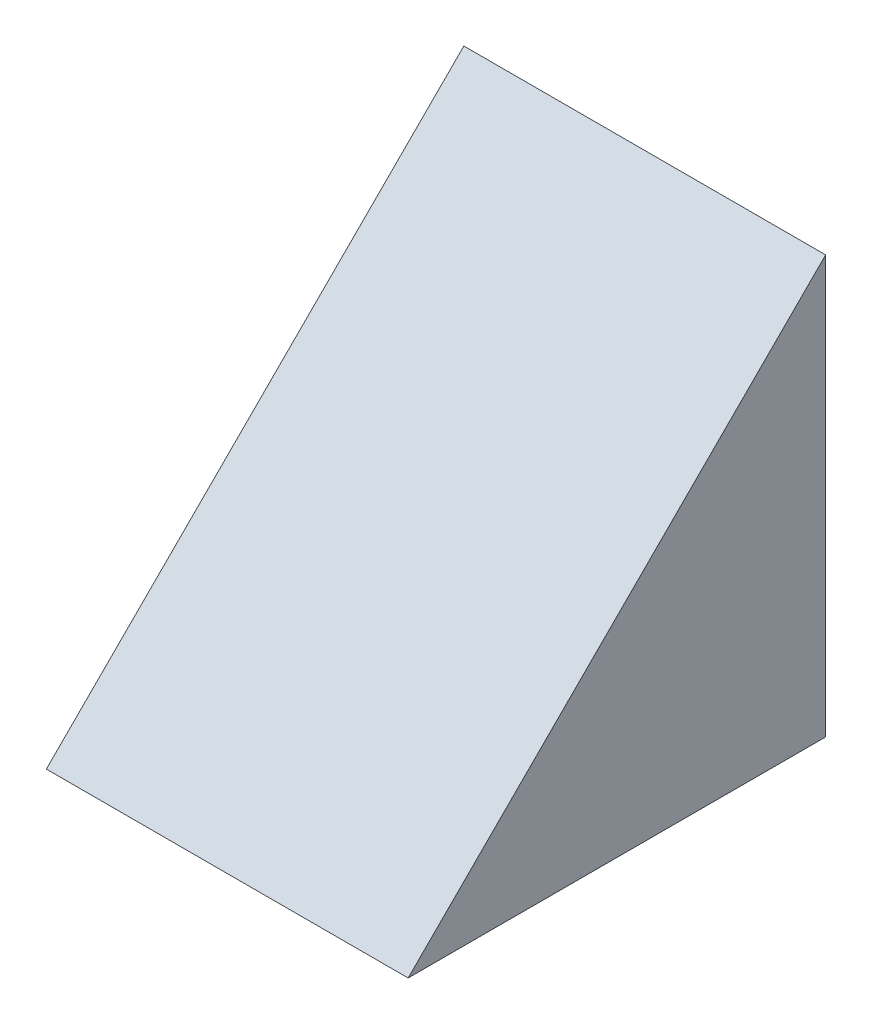
ISO-10303-21;
HEADER;
FILE_DESCRIPTION(('STEP AP214'),'2;1');
FILE_NAME('part.step','',(''),(''),'','','');
FILE_SCHEMA(('AUTOMOTIVE_DESIGN { 1 0 10303 214 1 1 1 1 }'));
ENDSEC;
DATA;
#1=APPLICATION_CONTEXT('core data for automotive mechanical design processes');
#2=APPLICATION_PROTOCOL_DEFINITION('international standard','automotive_design',2000,#1);
#3=PRODUCT_CONTEXT('',#1,'mechanical');
#4=PRODUCT('Part','Part','',(#3));
#5=PRODUCT_RELATED_PRODUCT_CATEGORY('part','',(#4));
#6=PRODUCT_DEFINITION_FORMATION('','',#4);
#7=PRODUCT_DEFINITION_CONTEXT('part definition',#1,'design');
#8=PRODUCT_DEFINITION('design','',#6,#7);
#9=PRODUCT_DEFINITION_SHAPE('','',#8);
#10=(LENGTH_UNIT() NAMED_UNIT(*) SI_UNIT(.MILLI.,.METRE.));
#11=(NAMED_UNIT(*) PLANE_ANGLE_UNIT() SI_UNIT($,.RADIAN.));
#12=(NAMED_UNIT(*) SI_UNIT($,.STERADIAN.) SOLID_ANGLE_UNIT());
#13=UNCERTAINTY_MEASURE_WITH_UNIT(LENGTH_MEASURE(1.E-05),#10,'distance_accuracy_value','');
#14=(GEOMETRIC_REPRESENTATION_CONTEXT(3) GLOBAL_UNCERTAINTY_ASSIGNED_CONTEXT((#13)) GLOBAL_UNIT_ASSIGNED_CONTEXT((#10,
#11,#12)) REPRESENTATION_CONTEXT('',''));
#15=CARTESIAN_POINT('',(0.,0.,0.));
#16=DIRECTION('',(0.,0.,1.));
#17=DIRECTION('',(1.,0.,0.));
#18=AXIS2_PLACEMENT_3D('',#15,#16,#17);
#19=CARTESIAN_POINT('',(-31.9579620432031,-51.9051508754386,37.3029575588053));
#20=DIRECTION('',(0.,-1.,0.));
#21=DIRECTION('',(0.,0.,-1.));
#22=AXIS2_PLACEMENT_3D('',#19,#20,#21);
#23=PLANE('',#22);
#24=DIRECTION('',(0.,0.,-1.));
#25=VECTOR('',#24,1.);
#26=CARTESIAN_POINT('',(-5.95796204320314,-51.9051508754386,37.3029575588053));
#27=LINE('',#26,#25);
#28=CARTESIAN_POINT('',(-5.95796204320314,-51.9051508754386,37.3029575588053));
#29=VERTEX_POINT('',#28);
#30=CARTESIAN_POINT('',(-5.95796204320314,-51.9051508754379,7.30295755880607));
#31=VERTEX_POINT('',#30);
#32=EDGE_CURVE('E85',#29,#31,#27,.T.);
#33=ORIENTED_EDGE('',*,*,#32,.F.);
#34=DIRECTION('',(1.,0.,0.));
#35=VECTOR('',#34,1.);
#36=CARTESIAN_POINT('',(-31.9579620432031,-51.9051508754386,37.3029575588053));
#37=LINE('',#36,#35);
#38=CARTESIAN_POINT('',(-31.9579620432031,-51.9051508754386,37.3029575588053));
#39=VERTEX_POINT('',#38);
#40=EDGE_CURVE('E11',#39,#29,#37,.T.);
#41=ORIENTED_EDGE('',*,*,#40,.F.);
#42=DIRECTION('',(0.,0.,-1.));
#43=VECTOR('',#42,1.);
#44=CARTESIAN_POINT('',(-31.9579620432031,-51.9051508754386,37.3029575588053));
#45=LINE('',#44,#43);
#46=CARTESIAN_POINT('',(-31.9579620432031,-51.9051508754379,7.30295755880607));
#47=VERTEX_POINT('',#46);
#48=EDGE_CURVE('E77',#39,#47,#45,.T.);
#49=ORIENTED_EDGE('',*,*,#48,.T.);
#50=DIRECTION('',(1.,0.,0.));
#51=VECTOR('',#50,1.);
#52=CARTESIAN_POINT('',(-31.9579620432031,-51.9051508754379,7.30295755880607));
#53=LINE('',#52,#51);
#54=EDGE_CURVE('E36',#47,#31,#53,.T.);
#55=ORIENTED_EDGE('',*,*,#54,.T.);
#56=EDGE_LOOP('',(#33,#41,#49,#55));
#57=FACE_BOUND('',#56,.T.);
#58=ADVANCED_FACE('F33',(#57),#23,.T.);
#59=CARTESIAN_POINT('',(-31.9579620432031,-21.9051508754379,7.30295755880607));
#60=DIRECTION('',(0.,0.70710678118653,0.707106781186565));
#61=DIRECTION('',(0.,-0.707106781186565,0.70710678118653));
#62=AXIS2_PLACEMENT_3D('',#59,#60,#61);
#63=PLANE('',#62);
#64=DIRECTION('',(0.,-0.707106781186565,0.70710678118653));
#65=VECTOR('',#64,1.);
#66=CARTESIAN_POINT('',(-5.95796204320314,-21.9051508754379,7.30295755880607));
#67=LINE('',#66,#65);
#68=CARTESIAN_POINT('',(-5.95796204320314,-21.9051508754379,7.30295755880607));
#69=VERTEX_POINT('',#68);
#70=EDGE_CURVE('E79',#69,#29,#67,.T.);
#71=ORIENTED_EDGE('',*,*,#70,.F.);
#72=DIRECTION('',(1.,0.,0.));
#73=VECTOR('',#72,1.);
#74=CARTESIAN_POINT('',(-31.9579620432031,-21.9051508754379,7.30295755880607));
#75=LINE('',#74,#73);
#76=CARTESIAN_POINT('',(-31.9579620432031,-21.9051508754379,7.30295755880607));
#77=VERTEX_POINT('',#76);
#78=EDGE_CURVE('E42',#77,#69,#75,.T.);
#79=ORIENTED_EDGE('',*,*,#78,.F.);
#80=DIRECTION('',(0.,-0.707106781186565,0.70710678118653));
#81=VECTOR('',#80,1.);
#82=CARTESIAN_POINT('',(-31.9579620432031,-21.9051508754379,7.30295755880607));
#83=LINE('',#82,#81);
#84=EDGE_CURVE('E74',#77,#39,#83,.T.);
#85=ORIENTED_EDGE('',*,*,#84,.T.);
#86=ORIENTED_EDGE('',*,*,#40,.T.);
#87=EDGE_LOOP('',(#71,#79,#85,#86));
#88=FACE_BOUND('',#87,.T.);
#89=ADVANCED_FACE('F89',(#88),#63,.T.);
#90=CARTESIAN_POINT('',(-31.9579620432031,-51.9051508754379,7.30295755880607));
#91=DIRECTION('',(0.,0.,-1.));
#92=DIRECTION('',(0.,1.,0.));
#93=AXIS2_PLACEMENT_3D('',#90,#91,#92);
#94=PLANE('',#93);
#95=DIRECTION('',(0.,1.,0.));
#96=VECTOR('',#95,1.);
#97=CARTESIAN_POINT('',(-5.95796204320314,-51.9051508754379,7.30295755880607));
#98=LINE('',#97,#96);
#99=EDGE_CURVE('E72',#31,#69,#98,.T.);
#100=ORIENTED_EDGE('',*,*,#99,.F.);
#101=ORIENTED_EDGE('',*,*,#54,.F.);
#102=DIRECTION('',(0.,1.,0.));
#103=VECTOR('',#102,1.);
#104=CARTESIAN_POINT('',(-31.9579620432031,-51.9051508754379,7.30295755880607));
#105=LINE('',#104,#103);
#106=EDGE_CURVE('E70',#47,#77,#105,.T.);
#107=ORIENTED_EDGE('',*,*,#106,.T.);
#108=ORIENTED_EDGE('',*,*,#78,.T.);
#109=EDGE_LOOP('',(#100,#101,#107,#108));
#110=FACE_BOUND('',#109,.T.);
#111=ADVANCED_FACE('F69',(#110),#94,.T.);
#112=CARTESIAN_POINT('',(-31.9579620432031,0.,0.));
#113=DIRECTION('',(1.,0.,0.));
#114=DIRECTION('',(0.,0.,-1.));
#115=AXIS2_PLACEMENT_3D('',#112,#113,#114);
#116=PLANE('',#115);
#117=ORIENTED_EDGE('',*,*,#48,.F.);
#118=ORIENTED_EDGE('',*,*,#84,.F.);
#119=ORIENTED_EDGE('',*,*,#106,.F.);
#120=EDGE_LOOP('',(#117,#118,#119));
#121=FACE_BOUND('',#120,.T.);
#122=ADVANCED_FACE('F76',(#121),#116,.F.);
#123=CARTESIAN_POINT('',(-5.95796204320314,0.,0.));
#124=DIRECTION('',(1.,0.,0.));
#125=DIRECTION('',(0.,0.,-1.));
#126=AXIS2_PLACEMENT_3D('',#123,#124,#125);
#127=PLANE('',#126);
#128=ORIENTED_EDGE('',*,*,#32,.T.);
#129=ORIENTED_EDGE('',*,*,#99,.T.);
#130=ORIENTED_EDGE('',*,*,#70,.T.);
#131=EDGE_LOOP('',(#128,#129,#130));
#132=FACE_BOUND('',#131,.T.);
#133=ADVANCED_FACE('F88',(#132),#127,.T.);
#134=CLOSED_SHELL('',(#58,#89,#111,#122,#133));
#135=MANIFOLD_SOLID_BREP('B2',#134);
#136=ADVANCED_BREP_SHAPE_REPRESENTATION('',(#18,#135),#14);
#137=SHAPE_DEFINITION_REPRESENTATION(#9,#136);
ENDSEC;
END-ISO-10303-21;
